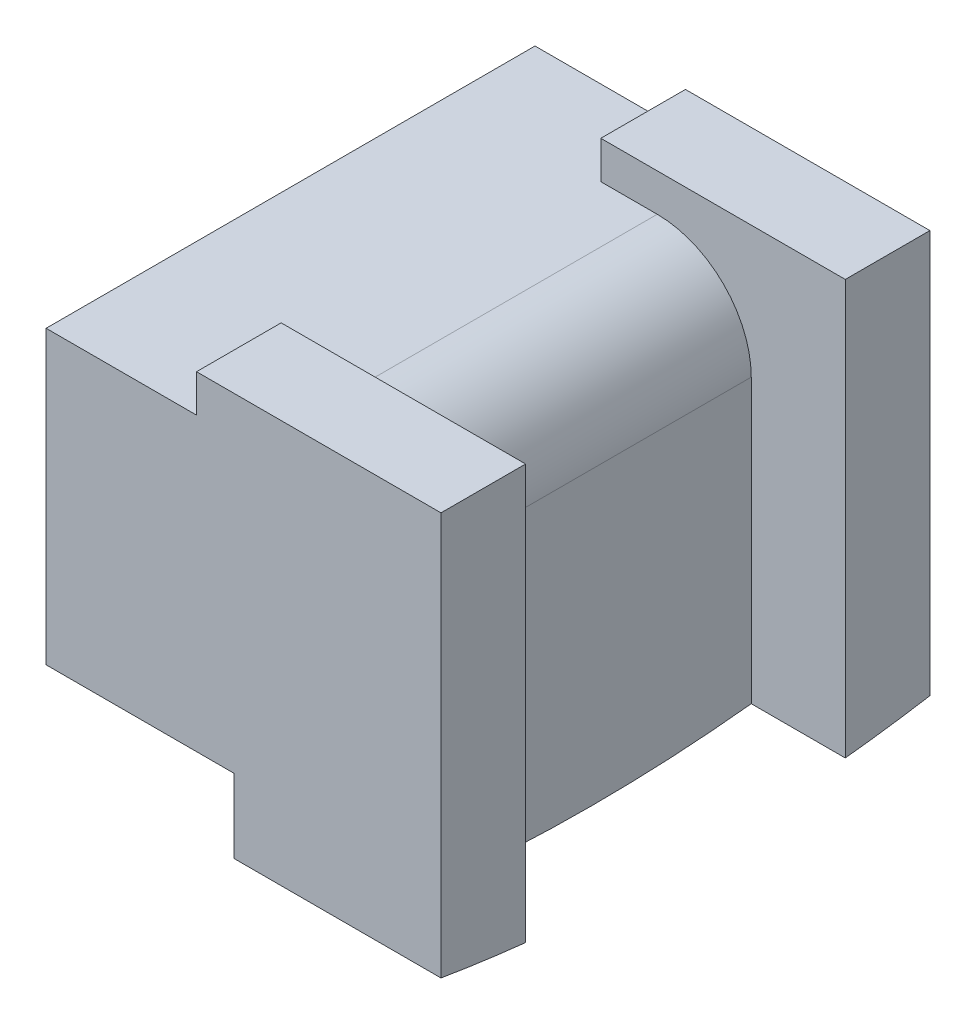
ISO-10303-21;
HEADER;
FILE_DESCRIPTION(('STEP AP214'),'2;1');
FILE_NAME('part.step','',(''),(''),'','','');
FILE_SCHEMA(('AUTOMOTIVE_DESIGN { 1 0 10303 214 1 1 1 1 }'));
ENDSEC;
DATA;
#1=APPLICATION_CONTEXT('core data for automotive mechanical design processes');
#2=APPLICATION_PROTOCOL_DEFINITION('international standard','automotive_design',2000,#1);
#3=PRODUCT_CONTEXT('',#1,'mechanical');
#4=PRODUCT('Part','Part','',(#3));
#5=PRODUCT_RELATED_PRODUCT_CATEGORY('part','',(#4));
#6=PRODUCT_DEFINITION_FORMATION('','',#4);
#7=PRODUCT_DEFINITION_CONTEXT('part definition',#1,'design');
#8=PRODUCT_DEFINITION('design','',#6,#7);
#9=PRODUCT_DEFINITION_SHAPE('','',#8);
#10=(LENGTH_UNIT() NAMED_UNIT(*) SI_UNIT(.MILLI.,.METRE.));
#11=(NAMED_UNIT(*) PLANE_ANGLE_UNIT() SI_UNIT($,.RADIAN.));
#12=(NAMED_UNIT(*) SI_UNIT($,.STERADIAN.) SOLID_ANGLE_UNIT());
#13=UNCERTAINTY_MEASURE_WITH_UNIT(LENGTH_MEASURE(1.E-05),#10,'distance_accuracy_value','');
#14=(GEOMETRIC_REPRESENTATION_CONTEXT(3) GLOBAL_UNCERTAINTY_ASSIGNED_CONTEXT((#13)) GLOBAL_UNIT_ASSIGNED_CONTEXT((#10,
#11,#12)) REPRESENTATION_CONTEXT('',''));
#15=CARTESIAN_POINT('',(0.,0.,0.));
#16=DIRECTION('',(0.,0.,1.));
#17=DIRECTION('',(1.,0.,0.));
#18=AXIS2_PLACEMENT_3D('',#15,#16,#17);
#19=CARTESIAN_POINT('',(69.6040845070422,-6.76091549295775,-0.85));
#20=DIRECTION('',(0.,0.,1.));
#21=DIRECTION('',(1.,0.,0.));
#22=AXIS2_PLACEMENT_3D('',#19,#20,#21);
#23=PLANE('',#22);
#24=CARTESIAN_POINT('',(69.24,-6.35,-0.85));
#25=DIRECTION('',(0.,0.,1.));
#26=DIRECTION('',(1.,0.,0.));
#27=AXIS2_PLACEMENT_3D('',#24,#25,#26);
#28=CIRCLE('',#27,0.500000000000001);
#29=CARTESIAN_POINT('',(69.24,-5.85,-0.85));
#30=VERTEX_POINT('',#29);
#31=CARTESIAN_POINT('',(69.74,-6.35,-0.85));
#32=VERTEX_POINT('',#31);
#33=EDGE_CURVE('E20',#30,#32,#28,.F.);
#34=ORIENTED_EDGE('',*,*,#33,.T.);
#35=DIRECTION('',(0.,1.,0.));
#36=VECTOR('',#35,1.);
#37=CARTESIAN_POINT('',(69.74,-6.76091549295775,-0.85));
#38=LINE('',#37,#36);
#39=CARTESIAN_POINT('',(69.74,-7.8541390362025,-0.85));
#40=VERTEX_POINT('',#39);
#41=EDGE_CURVE('E150',#32,#40,#38,.F.);
#42=ORIENTED_EDGE('',*,*,#41,.T.);
#43=DIRECTION('',(1.,0.,0.));
#44=VECTOR('',#43,1.);
#45=CARTESIAN_POINT('',(69.6040845070422,-7.8541390362025,-0.85));
#46=LINE('',#45,#44);
#47=CARTESIAN_POINT('',(70.24,-7.8541390362025,-0.85));
#48=VERTEX_POINT('',#47);
#49=EDGE_CURVE('E178',#40,#48,#46,.T.);
#50=ORIENTED_EDGE('',*,*,#49,.T.);
#51=DIRECTION('',(0.,1.,0.));
#52=VECTOR('',#51,1.);
#53=CARTESIAN_POINT('',(70.24,-6.775,-0.85));
#54=LINE('',#53,#52);
#55=CARTESIAN_POINT('',(70.24,-5.65,-0.85));
#56=VERTEX_POINT('',#55);
#57=EDGE_CURVE('E215',#56,#48,#54,.F.);
#58=ORIENTED_EDGE('',*,*,#57,.F.);
#59=DIRECTION('',(1.,0.,0.));
#60=VECTOR('',#59,1.);
#61=CARTESIAN_POINT('',(69.6040845070422,-5.65,-0.85));
#62=LINE('',#61,#60);
#63=CARTESIAN_POINT('',(68.94,-5.65,-0.85));
#64=VERTEX_POINT('',#63);
#65=EDGE_CURVE('E172',#56,#64,#62,.F.);
#66=ORIENTED_EDGE('',*,*,#65,.T.);
#67=DIRECTION('',(0.,1.,0.));
#68=VECTOR('',#67,1.);
#69=CARTESIAN_POINT('',(68.94,-6.76091549295775,-0.85));
#70=LINE('',#69,#68);
#71=CARTESIAN_POINT('',(68.94,-5.85,-0.85));
#72=VERTEX_POINT('',#71);
#73=EDGE_CURVE('E170',#64,#72,#70,.F.);
#74=ORIENTED_EDGE('',*,*,#73,.T.);
#75=DIRECTION('',(1.,0.,0.));
#76=VECTOR('',#75,1.);
#77=CARTESIAN_POINT('',(69.6040845070422,-5.85,-0.85));
#78=LINE('',#77,#76);
#79=EDGE_CURVE('E169',#72,#30,#78,.T.);
#80=ORIENTED_EDGE('',*,*,#79,.T.);
#81=EDGE_LOOP('',(#34,#42,#50,#58,#66,#74,#80));
#82=FACE_BOUND('',#81,.T.);
#83=ADVANCED_FACE('F17',(#82),#23,.T.);
#84=CARTESIAN_POINT('',(70.24,-6.775,-1.3));
#85=DIRECTION('',(1.,0.,0.));
#86=DIRECTION('',(0.,0.,-1.));
#87=AXIS2_PLACEMENT_3D('',#84,#85,#86);
#88=PLANE('',#87);
#89=DIRECTION('',(0.,0.,-1.));
#90=VECTOR('',#89,1.);
#91=CARTESIAN_POINT('',(70.24,-5.65,-1.3));
#92=LINE('',#91,#90);
#93=CARTESIAN_POINT('',(70.24,-5.65,-1.3));
#94=VERTEX_POINT('',#93);
#95=EDGE_CURVE('E209',#94,#56,#92,.F.);
#96=ORIENTED_EDGE('',*,*,#95,.T.);
#97=ORIENTED_EDGE('',*,*,#57,.T.);
#98=CARTESIAN_POINT('',(70.24,0.,0.));
#99=DIRECTION('',(1.,0.,0.));
#100=DIRECTION('',(0.,0.,-1.));
#101=AXIS2_PLACEMENT_3D('',#98,#99,#100);
#102=CIRCLE('',#101,7.9);
#103=CARTESIAN_POINT('',(70.24,-7.79230389551126,-1.3));
#104=VERTEX_POINT('',#103);
#105=EDGE_CURVE('E158',#48,#104,#102,.T.);
#106=ORIENTED_EDGE('',*,*,#105,.T.);
#107=DIRECTION('',(0.,1.,0.));
#108=VECTOR('',#107,1.);
#109=CARTESIAN_POINT('',(70.24,-6.76091549295775,-1.3));
#110=LINE('',#109,#108);
#111=EDGE_CURVE('E217',#104,#94,#110,.T.);
#112=ORIENTED_EDGE('',*,*,#111,.T.);
#113=EDGE_LOOP('',(#96,#97,#106,#112));
#114=FACE_BOUND('',#113,.T.);
#115=ADVANCED_FACE('F425',(#114),#88,.T.);
#116=CARTESIAN_POINT('',(69.6040845070422,-6.76091549295775,-1.3));
#117=DIRECTION('',(0.,0.,1.));
#118=DIRECTION('',(1.,0.,0.));
#119=AXIS2_PLACEMENT_3D('',#116,#117,#118);
#120=PLANE('',#119);
#121=DIRECTION('',(0.,1.,0.));
#122=VECTOR('',#121,1.);
#123=CARTESIAN_POINT('',(69.14,-6.76091549295775,-1.3));
#124=LINE('',#123,#122);
#125=CARTESIAN_POINT('',(69.14,-7.4,-1.3));
#126=VERTEX_POINT('',#125);
#127=CARTESIAN_POINT('',(69.14,-7.79230389551126,-1.3));
#128=VERTEX_POINT('',#127);
#129=EDGE_CURVE('E261',#126,#128,#124,.F.);
#130=ORIENTED_EDGE('',*,*,#129,.F.);
#131=DIRECTION('',(1.,0.,0.));
#132=VECTOR('',#131,1.);
#133=CARTESIAN_POINT('',(69.6040845070422,-7.4,-1.3));
#134=LINE('',#133,#132);
#135=CARTESIAN_POINT('',(68.14,-7.4,-1.3));
#136=VERTEX_POINT('',#135);
#137=EDGE_CURVE('E255',#136,#126,#134,.T.);
#138=ORIENTED_EDGE('',*,*,#137,.F.);
#139=DIRECTION('',(0.,1.,0.));
#140=VECTOR('',#139,1.);
#141=CARTESIAN_POINT('',(68.14,-6.76091549295775,-1.3));
#142=LINE('',#141,#140);
#143=CARTESIAN_POINT('',(68.14,-5.85,-1.3));
#144=VERTEX_POINT('',#143);
#145=EDGE_CURVE('E246',#144,#136,#142,.F.);
#146=ORIENTED_EDGE('',*,*,#145,.F.);
#147=DIRECTION('',(1.,0.,0.));
#148=VECTOR('',#147,1.);
#149=CARTESIAN_POINT('',(69.6040845070422,-5.85,-1.3));
#150=LINE('',#149,#148);
#151=CARTESIAN_POINT('',(68.94,-5.85,-1.3));
#152=VERTEX_POINT('',#151);
#153=EDGE_CURVE('E236',#152,#144,#150,.F.);
#154=ORIENTED_EDGE('',*,*,#153,.F.);
#155=DIRECTION('',(0.,1.,0.));
#156=VECTOR('',#155,1.);
#157=CARTESIAN_POINT('',(68.94,-6.76091549295775,-1.3));
#158=LINE('',#157,#156);
#159=CARTESIAN_POINT('',(68.94,-5.65,-1.3));
#160=VERTEX_POINT('',#159);
#161=EDGE_CURVE('E234',#160,#152,#158,.F.);
#162=ORIENTED_EDGE('',*,*,#161,.F.);
#163=DIRECTION('',(1.,0.,0.));
#164=VECTOR('',#163,1.);
#165=CARTESIAN_POINT('',(69.59,-5.65,-1.3));
#166=LINE('',#165,#164);
#167=EDGE_CURVE('E229',#94,#160,#166,.F.);
#168=ORIENTED_EDGE('',*,*,#167,.F.);
#169=ORIENTED_EDGE('',*,*,#111,.F.);
#170=DIRECTION('',(1.,0.,0.));
#171=VECTOR('',#170,1.);
#172=CARTESIAN_POINT('',(70.14,-7.79230389551126,-1.3));
#173=LINE('',#172,#171);
#174=EDGE_CURVE('E206',#128,#104,#173,.T.);
#175=ORIENTED_EDGE('',*,*,#174,.F.);
#176=EDGE_LOOP('',(#130,#138,#146,#154,#162,#168,#169,#175));
#177=FACE_BOUND('',#176,.T.);
#178=ADVANCED_FACE('F409',(#177),#120,.F.);
#179=CARTESIAN_POINT('',(69.6040845070422,-6.76091549295775,0.85));
#180=DIRECTION('',(0.,0.,1.));
#181=DIRECTION('',(1.,0.,0.));
#182=AXIS2_PLACEMENT_3D('',#179,#180,#181);
#183=PLANE('',#182);
#184=DIRECTION('',(0.,1.,0.));
#185=VECTOR('',#184,1.);
#186=CARTESIAN_POINT('',(69.74,-7.125,0.85));
#187=LINE('',#186,#185);
#188=CARTESIAN_POINT('',(69.74,-6.35,0.85));
#189=VERTEX_POINT('',#188);
#190=CARTESIAN_POINT('',(69.74,-7.85413903620251,0.849999999999999));
#191=VERTEX_POINT('',#190);
#192=EDGE_CURVE('E207',#189,#191,#187,.F.);
#193=ORIENTED_EDGE('',*,*,#192,.F.);
#194=CARTESIAN_POINT('',(69.24,-6.35,0.85));
#195=DIRECTION('',(0.,0.,1.));
#196=DIRECTION('',(1.,0.,0.));
#197=AXIS2_PLACEMENT_3D('',#194,#195,#196);
#198=CIRCLE('',#197,0.500000000000001);
#199=CARTESIAN_POINT('',(69.24,-5.85,0.85));
#200=VERTEX_POINT('',#199);
#201=EDGE_CURVE('E162',#200,#189,#198,.F.);
#202=ORIENTED_EDGE('',*,*,#201,.F.);
#203=DIRECTION('',(1.,0.,0.));
#204=VECTOR('',#203,1.);
#205=CARTESIAN_POINT('',(69.6040845070422,-5.85,0.85));
#206=LINE('',#205,#204);
#207=CARTESIAN_POINT('',(68.94,-5.85,0.85));
#208=VERTEX_POINT('',#207);
#209=EDGE_CURVE('E208',#208,#200,#206,.T.);
#210=ORIENTED_EDGE('',*,*,#209,.F.);
#211=DIRECTION('',(0.,1.,0.));
#212=VECTOR('',#211,1.);
#213=CARTESIAN_POINT('',(68.94,-6.76091549295775,0.85));
#214=LINE('',#213,#212);
#215=CARTESIAN_POINT('',(68.94,-5.65,0.85));
#216=VERTEX_POINT('',#215);
#217=EDGE_CURVE('E268',#216,#208,#214,.F.);
#218=ORIENTED_EDGE('',*,*,#217,.F.);
#219=DIRECTION('',(1.,0.,0.));
#220=VECTOR('',#219,1.);
#221=CARTESIAN_POINT('',(69.6040845070422,-5.65,0.85));
#222=LINE('',#221,#220);
#223=CARTESIAN_POINT('',(70.24,-5.65,0.85));
#224=VERTEX_POINT('',#223);
#225=EDGE_CURVE('E270',#224,#216,#222,.F.);
#226=ORIENTED_EDGE('',*,*,#225,.F.);
#227=DIRECTION('',(0.,1.,0.));
#228=VECTOR('',#227,1.);
#229=CARTESIAN_POINT('',(70.24,-6.775,0.85));
#230=LINE('',#229,#228);
#231=CARTESIAN_POINT('',(70.24,-7.85413903620251,0.849999999999999));
#232=VERTEX_POINT('',#231);
#233=EDGE_CURVE('E203',#232,#224,#230,.T.);
#234=ORIENTED_EDGE('',*,*,#233,.F.);
#235=DIRECTION('',(1.,0.,0.));
#236=VECTOR('',#235,1.);
#237=CARTESIAN_POINT('',(70.14,-7.85413903620251,0.849999999999998));
#238=LINE('',#237,#236);
#239=EDGE_CURVE('E204',#191,#232,#238,.T.);
#240=ORIENTED_EDGE('',*,*,#239,.F.);
#241=EDGE_LOOP('',(#193,#202,#210,#218,#226,#234,#240));
#242=FACE_BOUND('',#241,.T.);
#243=ADVANCED_FACE('F432',(#242),#183,.F.);
#244=CARTESIAN_POINT('',(69.74,-7.125,-1.3));
#245=DIRECTION('',(1.,0.,0.));
#246=DIRECTION('',(0.,0.,-1.));
#247=AXIS2_PLACEMENT_3D('',#244,#245,#246);
#248=PLANE('',#247);
#249=DIRECTION('',(0.,0.,1.));
#250=VECTOR('',#249,1.);
#251=CARTESIAN_POINT('',(69.74,-6.35,-1.3));
#252=LINE('',#251,#250);
#253=EDGE_CURVE('E152',#189,#32,#252,.F.);
#254=ORIENTED_EDGE('',*,*,#253,.F.);
#255=ORIENTED_EDGE('',*,*,#192,.T.);
#256=CARTESIAN_POINT('',(69.74,0.,0.));
#257=DIRECTION('',(1.,0.,0.));
#258=DIRECTION('',(0.,0.,-1.));
#259=AXIS2_PLACEMENT_3D('',#256,#257,#258);
#260=CIRCLE('',#259,7.9);
#261=EDGE_CURVE('E154',#40,#191,#260,.F.);
#262=ORIENTED_EDGE('',*,*,#261,.F.);
#263=ORIENTED_EDGE('',*,*,#41,.F.);
#264=EDGE_LOOP('',(#254,#255,#262,#263));
#265=FACE_BOUND('',#264,.T.);
#266=ADVANCED_FACE('F151',(#265),#248,.T.);
#267=CARTESIAN_POINT('',(69.59,-5.65,-1.3));
#268=DIRECTION('',(0.,1.,0.));
#269=DIRECTION('',(0.,0.,1.));
#270=AXIS2_PLACEMENT_3D('',#267,#268,#269);
#271=PLANE('',#270);
#272=ORIENTED_EDGE('',*,*,#167,.T.);
#273=DIRECTION('',(0.,0.,1.));
#274=VECTOR('',#273,1.);
#275=CARTESIAN_POINT('',(68.94,-5.65,-1.3));
#276=LINE('',#275,#274);
#277=EDGE_CURVE('E164',#64,#160,#276,.F.);
#278=ORIENTED_EDGE('',*,*,#277,.F.);
#279=ORIENTED_EDGE('',*,*,#65,.F.);
#280=ORIENTED_EDGE('',*,*,#95,.F.);
#281=EDGE_LOOP('',(#272,#278,#279,#280));
#282=FACE_BOUND('',#281,.T.);
#283=ADVANCED_FACE('F469',(#282),#271,.T.);
#284=CARTESIAN_POINT('',(70.14,0.,0.));
#285=DIRECTION('',(1.,0.,0.));
#286=DIRECTION('',(0.,0.,-1.));
#287=AXIS2_PLACEMENT_3D('',#284,#285,#286);
#288=CYLINDRICAL_SURFACE('',#287,7.9);
#289=DIRECTION('',(1.,0.,0.));
#290=VECTOR('',#289,1.);
#291=CARTESIAN_POINT('',(69.6040845070422,-7.85413903620251,0.85));
#292=LINE('',#291,#290);
#293=CARTESIAN_POINT('',(69.14,-7.85413903620251,0.85));
#294=VERTEX_POINT('',#293);
#295=CARTESIAN_POINT('',(69.24,-7.85413903620251,0.85));
#296=VERTEX_POINT('',#295);
#297=EDGE_CURVE('E190',#294,#296,#292,.T.);
#298=ORIENTED_EDGE('',*,*,#297,.T.);
#299=CARTESIAN_POINT('',(69.24,0.,0.));
#300=DIRECTION('',(1.,0.,0.));
#301=DIRECTION('',(0.,0.,-1.));
#302=AXIS2_PLACEMENT_3D('',#299,#300,#301);
#303=CIRCLE('',#302,7.9);
#304=CARTESIAN_POINT('',(69.24,-7.8541390362025,-0.85));
#305=VERTEX_POINT('',#304);
#306=EDGE_CURVE('E191',#305,#296,#303,.F.);
#307=ORIENTED_EDGE('',*,*,#306,.F.);
#308=DIRECTION('',(1.,0.,0.));
#309=VECTOR('',#308,1.);
#310=CARTESIAN_POINT('',(69.6040845070422,-7.8541390362025,-0.85));
#311=LINE('',#310,#309);
#312=CARTESIAN_POINT('',(69.14,-7.8541390362025,-0.85));
#313=VERTEX_POINT('',#312);
#314=EDGE_CURVE('E198',#313,#305,#311,.T.);
#315=ORIENTED_EDGE('',*,*,#314,.F.);
#316=CARTESIAN_POINT('',(69.14,0.,0.));
#317=DIRECTION('',(1.,0.,0.));
#318=DIRECTION('',(0.,0.,-1.));
#319=AXIS2_PLACEMENT_3D('',#316,#317,#318);
#320=CIRCLE('',#319,7.9);
#321=EDGE_CURVE('E195',#128,#313,#320,.F.);
#322=ORIENTED_EDGE('',*,*,#321,.F.);
#323=ORIENTED_EDGE('',*,*,#174,.T.);
#324=ORIENTED_EDGE('',*,*,#105,.F.);
#325=ORIENTED_EDGE('',*,*,#49,.F.);
#326=ORIENTED_EDGE('',*,*,#261,.T.);
#327=ORIENTED_EDGE('',*,*,#239,.T.);
#328=CARTESIAN_POINT('',(70.24,0.,0.));
#329=DIRECTION('',(1.,0.,0.));
#330=DIRECTION('',(0.,0.,-1.));
#331=AXIS2_PLACEMENT_3D('',#328,#329,#330);
#332=CIRCLE('',#331,7.9);
#333=CARTESIAN_POINT('',(70.24,-7.79230389551126,1.3));
#334=VERTEX_POINT('',#333);
#335=EDGE_CURVE('E200',#334,#232,#332,.T.);
#336=ORIENTED_EDGE('',*,*,#335,.F.);
#337=DIRECTION('',(1.,0.,0.));
#338=VECTOR('',#337,1.);
#339=CARTESIAN_POINT('',(69.6040845070422,-7.79230389551126,1.3));
#340=LINE('',#339,#338);
#341=CARTESIAN_POINT('',(69.14,-7.79230389551126,1.3));
#342=VERTEX_POINT('',#341);
#343=EDGE_CURVE('E343',#342,#334,#340,.T.);
#344=ORIENTED_EDGE('',*,*,#343,.F.);
#345=CARTESIAN_POINT('',(69.14,0.,0.));
#346=DIRECTION('',(1.,0.,0.));
#347=DIRECTION('',(0.,0.,-1.));
#348=AXIS2_PLACEMENT_3D('',#345,#346,#347);
#349=CIRCLE('',#348,7.9);
#350=EDGE_CURVE('E186',#294,#342,#349,.F.);
#351=ORIENTED_EDGE('',*,*,#350,.F.);
#352=EDGE_LOOP('',(#298,#307,#315,#322,#323,#324,#325,#326,#327,#336,#344,#351));
#353=FACE_BOUND('',#352,.T.);
#354=ADVANCED_FACE('F388',(#353),#288,.T.);
#355=CARTESIAN_POINT('',(70.24,-6.775,0.85));
#356=DIRECTION('',(1.,0.,0.));
#357=DIRECTION('',(0.,0.,-1.));
#358=AXIS2_PLACEMENT_3D('',#355,#356,#357);
#359=PLANE('',#358);
#360=DIRECTION('',(0.,0.,1.));
#361=VECTOR('',#360,1.);
#362=CARTESIAN_POINT('',(70.24,-5.65,0.85));
#363=LINE('',#362,#361);
#364=CARTESIAN_POINT('',(70.24,-5.65,1.3));
#365=VERTEX_POINT('',#364);
#366=EDGE_CURVE('E165',#365,#224,#363,.F.);
#367=ORIENTED_EDGE('',*,*,#366,.F.);
#368=DIRECTION('',(0.,1.,0.));
#369=VECTOR('',#368,1.);
#370=CARTESIAN_POINT('',(70.24,-6.76091549295775,1.3));
#371=LINE('',#370,#369);
#372=EDGE_CURVE('E338',#334,#365,#371,.T.);
#373=ORIENTED_EDGE('',*,*,#372,.F.);
#374=ORIENTED_EDGE('',*,*,#335,.T.);
#375=ORIENTED_EDGE('',*,*,#233,.T.);
#376=EDGE_LOOP('',(#367,#373,#374,#375));
#377=FACE_BOUND('',#376,.T.);
#378=ADVANCED_FACE('F393',(#377),#359,.T.);
#379=CARTESIAN_POINT('',(69.59,-5.65,0.85));
#380=DIRECTION('',(0.,1.,0.));
#381=DIRECTION('',(0.,0.,1.));
#382=AXIS2_PLACEMENT_3D('',#379,#380,#381);
#383=PLANE('',#382);
#384=ORIENTED_EDGE('',*,*,#225,.T.);
#385=DIRECTION('',(0.,0.,1.));
#386=VECTOR('',#385,1.);
#387=CARTESIAN_POINT('',(68.94,-5.65,0.85));
#388=LINE('',#387,#386);
#389=CARTESIAN_POINT('',(68.94,-5.65,1.3));
#390=VERTEX_POINT('',#389);
#391=EDGE_CURVE('E199',#390,#216,#388,.F.);
#392=ORIENTED_EDGE('',*,*,#391,.F.);
#393=DIRECTION('',(1.,0.,0.));
#394=VECTOR('',#393,1.);
#395=CARTESIAN_POINT('',(69.6040845070422,-5.65,1.3));
#396=LINE('',#395,#394);
#397=EDGE_CURVE('E334',#365,#390,#396,.F.);
#398=ORIENTED_EDGE('',*,*,#397,.F.);
#399=ORIENTED_EDGE('',*,*,#366,.T.);
#400=EDGE_LOOP('',(#384,#392,#398,#399));
#401=FACE_BOUND('',#400,.T.);
#402=ADVANCED_FACE('F396',(#401),#383,.T.);
#403=CARTESIAN_POINT('',(69.24,-6.35,-1.3));
#404=DIRECTION('',(0.,0.,1.));
#405=DIRECTION('',(1.,0.,0.));
#406=AXIS2_PLACEMENT_3D('',#403,#404,#405);
#407=CYLINDRICAL_SURFACE('',#406,0.500000000000001);
#408=ORIENTED_EDGE('',*,*,#33,.F.);
#409=DIRECTION('',(0.,0.,1.));
#410=VECTOR('',#409,1.);
#411=CARTESIAN_POINT('',(69.24,-5.85,-1.3));
#412=LINE('',#411,#410);
#413=EDGE_CURVE('E242',#200,#30,#412,.F.);
#414=ORIENTED_EDGE('',*,*,#413,.F.);
#415=ORIENTED_EDGE('',*,*,#201,.T.);
#416=ORIENTED_EDGE('',*,*,#253,.T.);
#417=EDGE_LOOP('',(#408,#414,#415,#416));
#418=FACE_BOUND('',#417,.T.);
#419=ADVANCED_FACE('F160',(#418),#407,.T.);
#420=CARTESIAN_POINT('',(68.94,-6.525,-1.3));
#421=DIRECTION('',(-1.,0.,0.));
#422=DIRECTION('',(0.,0.,1.));
#423=AXIS2_PLACEMENT_3D('',#420,#421,#422);
#424=PLANE('',#423);
#425=ORIENTED_EDGE('',*,*,#277,.T.);
#426=ORIENTED_EDGE('',*,*,#161,.T.);
#427=DIRECTION('',(0.,0.,1.));
#428=VECTOR('',#427,1.);
#429=CARTESIAN_POINT('',(68.94,-5.85,-1.3));
#430=LINE('',#429,#428);
#431=EDGE_CURVE('E239',#72,#152,#430,.F.);
#432=ORIENTED_EDGE('',*,*,#431,.F.);
#433=ORIENTED_EDGE('',*,*,#73,.F.);
#434=EDGE_LOOP('',(#425,#426,#432,#433));
#435=FACE_BOUND('',#434,.T.);
#436=ADVANCED_FACE('F457',(#435),#424,.T.);
#437=CARTESIAN_POINT('',(68.94,-6.525,0.85));
#438=DIRECTION('',(-1.,0.,0.));
#439=DIRECTION('',(0.,0.,1.));
#440=AXIS2_PLACEMENT_3D('',#437,#438,#439);
#441=PLANE('',#440);
#442=ORIENTED_EDGE('',*,*,#391,.T.);
#443=ORIENTED_EDGE('',*,*,#217,.T.);
#444=DIRECTION('',(0.,0.,1.));
#445=VECTOR('',#444,1.);
#446=CARTESIAN_POINT('',(68.94,-5.85,-1.3));
#447=LINE('',#446,#445);
#448=CARTESIAN_POINT('',(68.94,-5.85,1.3));
#449=VERTEX_POINT('',#448);
#450=EDGE_CURVE('E273',#449,#208,#447,.F.);
#451=ORIENTED_EDGE('',*,*,#450,.F.);
#452=DIRECTION('',(0.,1.,0.));
#453=VECTOR('',#452,1.);
#454=CARTESIAN_POINT('',(68.94,-6.76091549295775,1.3));
#455=LINE('',#454,#453);
#456=EDGE_CURVE('E337',#390,#449,#455,.F.);
#457=ORIENTED_EDGE('',*,*,#456,.F.);
#458=EDGE_LOOP('',(#442,#443,#451,#457));
#459=FACE_BOUND('',#458,.T.);
#460=ADVANCED_FACE('F400',(#459),#441,.T.);
#461=CARTESIAN_POINT('',(69.14,-7.65,-1.3));
#462=DIRECTION('',(-1.,0.,0.));
#463=DIRECTION('',(0.,0.,1.));
#464=AXIS2_PLACEMENT_3D('',#461,#462,#463);
#465=PLANE('',#464);
#466=DIRECTION('',(0.,0.,-1.));
#467=VECTOR('',#466,1.);
#468=CARTESIAN_POINT('',(69.14,-7.4,0.85));
#469=LINE('',#468,#467);
#470=CARTESIAN_POINT('',(69.14,-7.4,-0.85));
#471=VERTEX_POINT('',#470);
#472=EDGE_CURVE('E297',#126,#471,#469,.F.);
#473=ORIENTED_EDGE('',*,*,#472,.F.);
#474=ORIENTED_EDGE('',*,*,#129,.T.);
#475=ORIENTED_EDGE('',*,*,#321,.T.);
#476=DIRECTION('',(0.,1.,0.));
#477=VECTOR('',#476,1.);
#478=CARTESIAN_POINT('',(69.14,-6.76091549295775,-0.85));
#479=LINE('',#478,#477);
#480=EDGE_CURVE('E194',#471,#313,#479,.F.);
#481=ORIENTED_EDGE('',*,*,#480,.F.);
#482=EDGE_LOOP('',(#473,#474,#475,#481));
#483=FACE_BOUND('',#482,.T.);
#484=ADVANCED_FACE('F414',(#483),#465,.T.);
#485=CARTESIAN_POINT('',(69.6040845070422,-6.76091549295775,-0.85));
#486=DIRECTION('',(0.,0.,1.));
#487=DIRECTION('',(1.,0.,0.));
#488=AXIS2_PLACEMENT_3D('',#485,#486,#487);
#489=PLANE('',#488);
#490=DIRECTION('',(1.,0.,0.));
#491=VECTOR('',#490,1.);
#492=CARTESIAN_POINT('',(69.04,-7.4,-0.85));
#493=LINE('',#492,#491);
#494=CARTESIAN_POINT('',(69.24,-7.4,-0.85));
#495=VERTEX_POINT('',#494);
#496=EDGE_CURVE('E300',#471,#495,#493,.T.);
#497=ORIENTED_EDGE('',*,*,#496,.F.);
#498=ORIENTED_EDGE('',*,*,#480,.T.);
#499=ORIENTED_EDGE('',*,*,#314,.T.);
#500=DIRECTION('',(0.,1.,0.));
#501=VECTOR('',#500,1.);
#502=CARTESIAN_POINT('',(69.24,-7.65,-0.85));
#503=LINE('',#502,#501);
#504=EDGE_CURVE('E193',#495,#305,#503,.F.);
#505=ORIENTED_EDGE('',*,*,#504,.F.);
#506=EDGE_LOOP('',(#497,#498,#499,#505));
#507=FACE_BOUND('',#506,.T.);
#508=ADVANCED_FACE('F418',(#507),#489,.T.);
#509=CARTESIAN_POINT('',(69.24,-7.65,-1.3));
#510=DIRECTION('',(-1.,0.,0.));
#511=DIRECTION('',(0.,0.,1.));
#512=AXIS2_PLACEMENT_3D('',#509,#510,#511);
#513=PLANE('',#512);
#514=DIRECTION('',(0.,0.,-1.));
#515=VECTOR('',#514,1.);
#516=CARTESIAN_POINT('',(69.24,-7.4,0.85));
#517=LINE('',#516,#515);
#518=CARTESIAN_POINT('',(69.24,-7.4,0.85));
#519=VERTEX_POINT('',#518);
#520=EDGE_CURVE('E309',#495,#519,#517,.F.);
#521=ORIENTED_EDGE('',*,*,#520,.F.);
#522=ORIENTED_EDGE('',*,*,#504,.T.);
#523=ORIENTED_EDGE('',*,*,#306,.T.);
#524=DIRECTION('',(0.,1.,0.));
#525=VECTOR('',#524,1.);
#526=CARTESIAN_POINT('',(69.24,-6.76091549295775,0.85));
#527=LINE('',#526,#525);
#528=EDGE_CURVE('E319',#296,#519,#527,.T.);
#529=ORIENTED_EDGE('',*,*,#528,.T.);
#530=EDGE_LOOP('',(#521,#522,#523,#529));
#531=FACE_BOUND('',#530,.T.);
#532=ADVANCED_FACE('F421',(#531),#513,.T.);
#533=CARTESIAN_POINT('',(69.6040845070422,-6.76091549295775,0.85));
#534=DIRECTION('',(0.,0.,1.));
#535=DIRECTION('',(1.,0.,0.));
#536=AXIS2_PLACEMENT_3D('',#533,#534,#535);
#537=PLANE('',#536);
#538=DIRECTION('',(0.,1.,0.));
#539=VECTOR('',#538,1.);
#540=CARTESIAN_POINT('',(69.14,-7.65,0.85));
#541=LINE('',#540,#539);
#542=CARTESIAN_POINT('',(69.14,-7.4,0.85));
#543=VERTEX_POINT('',#542);
#544=EDGE_CURVE('E189',#543,#294,#541,.F.);
#545=ORIENTED_EDGE('',*,*,#544,.F.);
#546=DIRECTION('',(1.,0.,0.));
#547=VECTOR('',#546,1.);
#548=CARTESIAN_POINT('',(69.04,-7.4,0.85));
#549=LINE('',#548,#547);
#550=EDGE_CURVE('E316',#519,#543,#549,.F.);
#551=ORIENTED_EDGE('',*,*,#550,.F.);
#552=ORIENTED_EDGE('',*,*,#528,.F.);
#553=ORIENTED_EDGE('',*,*,#297,.F.);
#554=EDGE_LOOP('',(#545,#551,#552,#553));
#555=FACE_BOUND('',#554,.T.);
#556=ADVANCED_FACE('F424',(#555),#537,.F.);
#557=CARTESIAN_POINT('',(69.14,-7.65,0.85));
#558=DIRECTION('',(-1.,0.,0.));
#559=DIRECTION('',(0.,0.,1.));
#560=AXIS2_PLACEMENT_3D('',#557,#558,#559);
#561=PLANE('',#560);
#562=DIRECTION('',(0.,0.,-1.));
#563=VECTOR('',#562,1.);
#564=CARTESIAN_POINT('',(69.14,-7.4,0.85));
#565=LINE('',#564,#563);
#566=CARTESIAN_POINT('',(69.14,-7.4,1.3));
#567=VERTEX_POINT('',#566);
#568=EDGE_CURVE('E325',#543,#567,#565,.F.);
#569=ORIENTED_EDGE('',*,*,#568,.F.);
#570=ORIENTED_EDGE('',*,*,#544,.T.);
#571=ORIENTED_EDGE('',*,*,#350,.T.);
#572=DIRECTION('',(0.,1.,0.));
#573=VECTOR('',#572,1.);
#574=CARTESIAN_POINT('',(69.14,-6.76091549295775,1.3));
#575=LINE('',#574,#573);
#576=EDGE_CURVE('E277',#567,#342,#575,.F.);
#577=ORIENTED_EDGE('',*,*,#576,.F.);
#578=EDGE_LOOP('',(#569,#570,#571,#577));
#579=FACE_BOUND('',#578,.T.);
#580=ADVANCED_FACE('F385',(#579),#561,.T.);
#581=CARTESIAN_POINT('',(69.6040845070422,-6.76091549295775,1.3));
#582=DIRECTION('',(0.,0.,1.));
#583=DIRECTION('',(1.,0.,0.));
#584=AXIS2_PLACEMENT_3D('',#581,#582,#583);
#585=PLANE('',#584);
#586=DIRECTION('',(1.,0.,0.));
#587=VECTOR('',#586,1.);
#588=CARTESIAN_POINT('',(69.04,-7.4,1.3));
#589=LINE('',#588,#587);
#590=CARTESIAN_POINT('',(68.14,-7.4,1.3));
#591=VERTEX_POINT('',#590);
#592=EDGE_CURVE('E276',#567,#591,#589,.F.);
#593=ORIENTED_EDGE('',*,*,#592,.F.);
#594=ORIENTED_EDGE('',*,*,#576,.T.);
#595=ORIENTED_EDGE('',*,*,#343,.T.);
#596=ORIENTED_EDGE('',*,*,#372,.T.);
#597=ORIENTED_EDGE('',*,*,#397,.T.);
#598=ORIENTED_EDGE('',*,*,#456,.T.);
#599=DIRECTION('',(1.,0.,0.));
#600=VECTOR('',#599,1.);
#601=CARTESIAN_POINT('',(68.69,-5.85,1.3));
#602=LINE('',#601,#600);
#603=CARTESIAN_POINT('',(68.14,-5.85,1.3));
#604=VERTEX_POINT('',#603);
#605=EDGE_CURVE('E35',#604,#449,#602,.T.);
#606=ORIENTED_EDGE('',*,*,#605,.F.);
#607=DIRECTION('',(0.,1.,0.));
#608=VECTOR('',#607,1.);
#609=CARTESIAN_POINT('',(68.14,-6.625,1.3));
#610=LINE('',#609,#608);
#611=EDGE_CURVE('E251',#591,#604,#610,.T.);
#612=ORIENTED_EDGE('',*,*,#611,.F.);
#613=EDGE_LOOP('',(#593,#594,#595,#596,#597,#598,#606,#612));
#614=FACE_BOUND('',#613,.T.);
#615=ADVANCED_FACE('F378',(#614),#585,.T.);
#616=CARTESIAN_POINT('',(68.69,-5.85,-1.3));
#617=DIRECTION('',(0.,1.,0.));
#618=DIRECTION('',(0.,0.,1.));
#619=AXIS2_PLACEMENT_3D('',#616,#617,#618);
#620=PLANE('',#619);
#621=ORIENTED_EDGE('',*,*,#605,.T.);
#622=ORIENTED_EDGE('',*,*,#450,.T.);
#623=ORIENTED_EDGE('',*,*,#209,.T.);
#624=ORIENTED_EDGE('',*,*,#413,.T.);
#625=ORIENTED_EDGE('',*,*,#79,.F.);
#626=ORIENTED_EDGE('',*,*,#431,.T.);
#627=ORIENTED_EDGE('',*,*,#153,.T.);
#628=DIRECTION('',(0.,0.,1.));
#629=VECTOR('',#628,1.);
#630=CARTESIAN_POINT('',(68.14,-5.85,-1.3));
#631=LINE('',#630,#629);
#632=EDGE_CURVE('E26',#604,#144,#631,.F.);
#633=ORIENTED_EDGE('',*,*,#632,.F.);
#634=EDGE_LOOP('',(#621,#622,#623,#624,#625,#626,#627,#633));
#635=FACE_BOUND('',#634,.T.);
#636=ADVANCED_FACE('F404',(#635),#620,.T.);
#637=CARTESIAN_POINT('',(69.04,-7.4,0.85));
#638=DIRECTION('',(0.,-1.,0.));
#639=DIRECTION('',(0.,0.,-1.));
#640=AXIS2_PLACEMENT_3D('',#637,#638,#639);
#641=PLANE('',#640);
#642=ORIENTED_EDGE('',*,*,#550,.T.);
#643=ORIENTED_EDGE('',*,*,#568,.T.);
#644=ORIENTED_EDGE('',*,*,#592,.T.);
#645=DIRECTION('',(0.,0.,1.));
#646=VECTOR('',#645,1.);
#647=CARTESIAN_POINT('',(68.14,-7.4,-1.3));
#648=LINE('',#647,#646);
#649=EDGE_CURVE('E11',#136,#591,#648,.T.);
#650=ORIENTED_EDGE('',*,*,#649,.F.);
#651=ORIENTED_EDGE('',*,*,#137,.T.);
#652=ORIENTED_EDGE('',*,*,#472,.T.);
#653=ORIENTED_EDGE('',*,*,#496,.T.);
#654=ORIENTED_EDGE('',*,*,#520,.T.);
#655=EDGE_LOOP('',(#642,#643,#644,#650,#651,#652,#653,#654));
#656=FACE_BOUND('',#655,.T.);
#657=ADVANCED_FACE('F380',(#656),#641,.T.);
#658=CARTESIAN_POINT('',(68.14,-6.625,-1.3));
#659=DIRECTION('',(-1.,0.,0.));
#660=DIRECTION('',(0.,0.,1.));
#661=AXIS2_PLACEMENT_3D('',#658,#659,#660);
#662=PLANE('',#661);
#663=ORIENTED_EDGE('',*,*,#145,.T.);
#664=ORIENTED_EDGE('',*,*,#649,.T.);
#665=ORIENTED_EDGE('',*,*,#611,.T.);
#666=ORIENTED_EDGE('',*,*,#632,.T.);
#667=EDGE_LOOP('',(#663,#664,#665,#666));
#668=FACE_BOUND('',#667,.T.);
#669=ADVANCED_FACE('F374',(#668),#662,.T.);
#670=CLOSED_SHELL('',(#83,#115,#178,#243,#266,#283,#354,#378,#402,#419,#436,#460,#484,#508,#532,
#556,#580,#615,#636,#657,#669));
#671=MANIFOLD_SOLID_BREP('B1',#670);
#672=ADVANCED_BREP_SHAPE_REPRESENTATION('',(#18,#671),#14);
#673=SHAPE_DEFINITION_REPRESENTATION(#9,#672);
ENDSEC;
END-ISO-10303-21;
